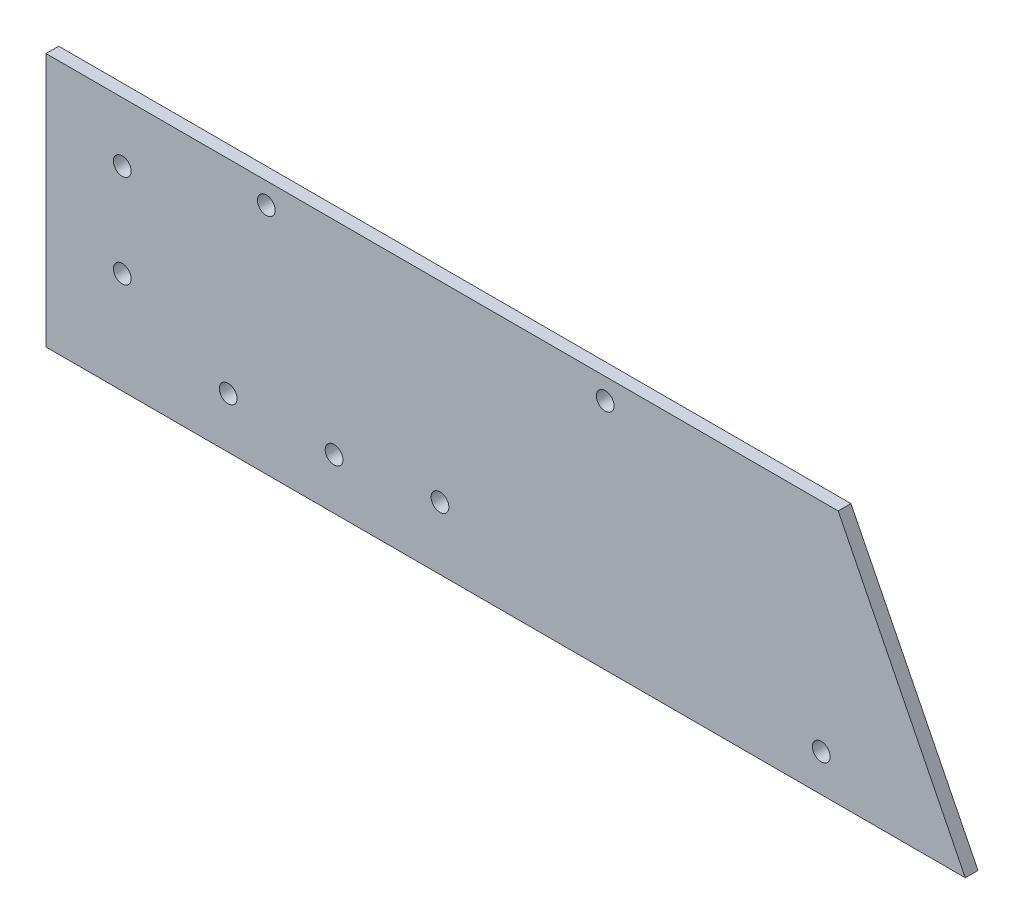
ISO-10303-21;
HEADER;
FILE_DESCRIPTION(('STEP AP214'),'2;1');
FILE_NAME('part.step','',(''),(''),'','','');
FILE_SCHEMA(('AUTOMOTIVE_DESIGN { 1 0 10303 214 1 1 1 1 }'));
ENDSEC;
DATA;
#1=APPLICATION_CONTEXT('core data for automotive mechanical design processes');
#2=APPLICATION_PROTOCOL_DEFINITION('international standard','automotive_design',2000,#1);
#3=PRODUCT_CONTEXT('',#1,'mechanical');
#4=PRODUCT('Part','Part','',(#3));
#5=PRODUCT_RELATED_PRODUCT_CATEGORY('part','',(#4));
#6=PRODUCT_DEFINITION_FORMATION('','',#4);
#7=PRODUCT_DEFINITION_CONTEXT('part definition',#1,'design');
#8=PRODUCT_DEFINITION('design','',#6,#7);
#9=PRODUCT_DEFINITION_SHAPE('','',#8);
#10=(LENGTH_UNIT() NAMED_UNIT(*) SI_UNIT(.MILLI.,.METRE.));
#11=(NAMED_UNIT(*) PLANE_ANGLE_UNIT() SI_UNIT($,.RADIAN.));
#12=(NAMED_UNIT(*) SI_UNIT($,.STERADIAN.) SOLID_ANGLE_UNIT());
#13=UNCERTAINTY_MEASURE_WITH_UNIT(LENGTH_MEASURE(1.E-05),#10,'distance_accuracy_value','');
#14=(GEOMETRIC_REPRESENTATION_CONTEXT(3) GLOBAL_UNCERTAINTY_ASSIGNED_CONTEXT((#13)) GLOBAL_UNIT_ASSIGNED_CONTEXT((#10,
#11,#12)) REPRESENTATION_CONTEXT('',''));
#15=CARTESIAN_POINT('',(0.,0.,0.));
#16=DIRECTION('',(0.,0.,1.));
#17=DIRECTION('',(1.,0.,0.));
#18=AXIS2_PLACEMENT_3D('',#15,#16,#17);
#19=CARTESIAN_POINT('',(0.,60.,3.));
#20=DIRECTION('',(0.,-1.,0.));
#21=DIRECTION('',(0.,0.,-1.));
#22=AXIS2_PLACEMENT_3D('',#19,#20,#21);
#23=PLANE('',#22);
#24=DIRECTION('',(0.,0.,1.));
#25=VECTOR('',#24,1.);
#26=CARTESIAN_POINT('',(187.,60.,0.));
#27=LINE('',#26,#25);
#28=CARTESIAN_POINT('',(187.,60.,0.));
#29=VERTEX_POINT('',#28);
#30=CARTESIAN_POINT('',(187.,60.,3.));
#31=VERTEX_POINT('',#30);
#32=EDGE_CURVE('E88',#29,#31,#27,.T.);
#33=ORIENTED_EDGE('',*,*,#32,.F.);
#34=DIRECTION('',(-1.,0.,0.));
#35=VECTOR('',#34,1.);
#36=CARTESIAN_POINT('',(0.,60.,0.));
#37=LINE('',#36,#35);
#38=CARTESIAN_POINT('',(0.,60.,0.));
#39=VERTEX_POINT('',#38);
#40=EDGE_CURVE('E83',#29,#39,#37,.T.);
#41=ORIENTED_EDGE('',*,*,#40,.T.);
#42=DIRECTION('',(0.,0.,-1.));
#43=VECTOR('',#42,1.);
#44=CARTESIAN_POINT('',(0.,60.,3.));
#45=LINE('',#44,#43);
#46=CARTESIAN_POINT('',(0.,60.,3.));
#47=VERTEX_POINT('',#46);
#48=EDGE_CURVE('E85',#47,#39,#45,.T.);
#49=ORIENTED_EDGE('',*,*,#48,.F.);
#50=DIRECTION('',(-1.,0.,0.));
#51=VECTOR('',#50,1.);
#52=CARTESIAN_POINT('',(0.,60.,3.));
#53=LINE('',#52,#51);
#54=EDGE_CURVE('E63',#31,#47,#53,.T.);
#55=ORIENTED_EDGE('',*,*,#54,.F.);
#56=EDGE_LOOP('',(#33,#41,#49,#55));
#57=FACE_BOUND('',#56,.T.);
#58=ADVANCED_FACE('F45',(#57),#23,.F.);
#59=CARTESIAN_POINT('',(0.,0.,3.));
#60=DIRECTION('',(0.,0.,-1.));
#61=DIRECTION('',(-1.,0.,0.));
#62=AXIS2_PLACEMENT_3D('',#59,#60,#61);
#63=PLANE('',#62);
#64=CARTESIAN_POINT('',(132.,55.0000000000013,3.));
#65=DIRECTION('',(0.,0.,-1.));
#66=DIRECTION('',(-1.,0.,0.));
#67=AXIS2_PLACEMENT_3D('',#64,#65,#66);
#68=CIRCLE('',#67,2.09999999999999);
#69=CARTESIAN_POINT('',(129.9,55.0000000000013,3.));
#70=VERTEX_POINT('',#69);
#71=EDGE_CURVE('E170',#70,#70,#68,.T.);
#72=ORIENTED_EDGE('',*,*,#71,.T.);
#73=EDGE_LOOP('',(#72));
#74=FACE_BOUND('',#73,.T.);
#75=CARTESIAN_POINT('',(51.9999999999998,55.0000000000008,3.));
#76=DIRECTION('',(0.,0.,-1.));
#77=DIRECTION('',(-1.,0.,0.));
#78=AXIS2_PLACEMENT_3D('',#75,#76,#77);
#79=CIRCLE('',#78,2.09999999999999);
#80=CARTESIAN_POINT('',(49.8999999999998,55.0000000000008,3.));
#81=VERTEX_POINT('',#80);
#82=EDGE_CURVE('E174',#81,#81,#79,.T.);
#83=ORIENTED_EDGE('',*,*,#82,.T.);
#84=EDGE_LOOP('',(#83));
#85=FACE_BOUND('',#84,.T.);
#86=CARTESIAN_POINT('',(18.0000000000016,45.9999999999995,3.));
#87=DIRECTION('',(0.,0.,1.));
#88=DIRECTION('',(1.,0.,0.));
#89=AXIS2_PLACEMENT_3D('',#86,#87,#88);
#90=CIRCLE('',#89,2.1);
#91=CARTESIAN_POINT('',(20.1000000000016,45.9999999999995,3.));
#92=VERTEX_POINT('',#91);
#93=EDGE_CURVE('E166',#92,#92,#90,.T.);
#94=ORIENTED_EDGE('',*,*,#93,.F.);
#95=EDGE_LOOP('',(#94));
#96=FACE_BOUND('',#95,.T.);
#97=CARTESIAN_POINT('',(92.9999999999996,14.7999999999999,3.));
#98=DIRECTION('',(0.,0.,1.));
#99=DIRECTION('',(1.,0.,0.));
#100=AXIS2_PLACEMENT_3D('',#97,#98,#99);
#101=CIRCLE('',#100,2.09999999999999);
#102=CARTESIAN_POINT('',(95.0999999999996,14.7999999999999,3.));
#103=VERTEX_POINT('',#102);
#104=EDGE_CURVE('E159',#103,#103,#101,.T.);
#105=ORIENTED_EDGE('',*,*,#104,.F.);
#106=EDGE_LOOP('',(#105));
#107=FACE_BOUND('',#106,.T.);
#108=CARTESIAN_POINT('',(183.,8.79999999999957,3.));
#109=DIRECTION('',(0.,0.,1.));
#110=DIRECTION('',(1.,0.,0.));
#111=AXIS2_PLACEMENT_3D('',#108,#109,#110);
#112=CIRCLE('',#111,2.10000000000002);
#113=CARTESIAN_POINT('',(185.1,8.79999999999957,3.));
#114=VERTEX_POINT('',#113);
#115=EDGE_CURVE('E150',#114,#114,#112,.T.);
#116=ORIENTED_EDGE('',*,*,#115,.F.);
#117=EDGE_LOOP('',(#116));
#118=FACE_BOUND('',#117,.T.);
#119=CARTESIAN_POINT('',(18.0000000000016,23.9999999999994,3.));
#120=DIRECTION('',(0.,0.,-1.));
#121=DIRECTION('',(-1.,0.,0.));
#122=AXIS2_PLACEMENT_3D('',#119,#120,#121);
#123=CIRCLE('',#122,2.1);
#124=CARTESIAN_POINT('',(15.9000000000016,23.9999999999994,3.));
#125=VERTEX_POINT('',#124);
#126=EDGE_CURVE('E123',#125,#125,#123,.T.);
#127=ORIENTED_EDGE('',*,*,#126,.T.);
#128=EDGE_LOOP('',(#127));
#129=FACE_BOUND('',#128,.T.);
#130=CARTESIAN_POINT('',(43.0000000000016,11.9999999999994,3.));
#131=DIRECTION('',(0.,0.,-1.));
#132=DIRECTION('',(-1.,0.,0.));
#133=AXIS2_PLACEMENT_3D('',#130,#131,#132);
#134=CIRCLE('',#133,2.1);
#135=CARTESIAN_POINT('',(40.9000000000016,11.9999999999994,3.));
#136=VERTEX_POINT('',#135);
#137=EDGE_CURVE('E139',#136,#136,#134,.T.);
#138=ORIENTED_EDGE('',*,*,#137,.T.);
#139=EDGE_LOOP('',(#138));
#140=FACE_BOUND('',#139,.T.);
#141=CARTESIAN_POINT('',(68.0000000000016,11.9999999999994,3.));
#142=DIRECTION('',(0.,0.,-1.));
#143=DIRECTION('',(-1.,0.,0.));
#144=AXIS2_PLACEMENT_3D('',#141,#142,#143);
#145=CIRCLE('',#144,2.1);
#146=CARTESIAN_POINT('',(65.9000000000016,11.9999999999994,3.));
#147=VERTEX_POINT('',#146);
#148=EDGE_CURVE('E130',#147,#147,#145,.T.);
#149=ORIENTED_EDGE('',*,*,#148,.T.);
#150=EDGE_LOOP('',(#149));
#151=FACE_BOUND('',#150,.T.);
#152=DIRECTION('',(-0.447213595499958,0.894427190999916,0.));
#153=VECTOR('',#152,1.);
#154=CARTESIAN_POINT('',(173.6,86.8,3.));
#155=LINE('',#154,#153);
#156=CARTESIAN_POINT('',(217.,0.,3.));
#157=VERTEX_POINT('',#156);
#158=EDGE_CURVE('E120',#157,#31,#155,.T.);
#159=ORIENTED_EDGE('',*,*,#158,.T.);
#160=ORIENTED_EDGE('',*,*,#54,.T.);
#161=DIRECTION('',(0.,-1.,0.));
#162=VECTOR('',#161,1.);
#163=CARTESIAN_POINT('',(0.,0.,3.));
#164=LINE('',#163,#162);
#165=CARTESIAN_POINT('',(0.,0.,3.));
#166=VERTEX_POINT('',#165);
#167=EDGE_CURVE('E92',#47,#166,#164,.T.);
#168=ORIENTED_EDGE('',*,*,#167,.T.);
#169=DIRECTION('',(1.,0.,0.));
#170=VECTOR('',#169,1.);
#171=CARTESIAN_POINT('',(0.,0.,3.));
#172=LINE('',#171,#170);
#173=EDGE_CURVE('E115',#166,#157,#172,.T.);
#174=ORIENTED_EDGE('',*,*,#173,.T.);
#175=EDGE_LOOP('',(#159,#160,#168,#174));
#176=FACE_BOUND('',#175,.T.);
#177=ADVANCED_FACE('F190',(#74,#85,#96,#107,#118,#129,#140,#151,#176),#63,.F.);
#178=CARTESIAN_POINT('',(0.,0.,0.));
#179=DIRECTION('',(0.,0.,-1.));
#180=DIRECTION('',(-1.,0.,0.));
#181=AXIS2_PLACEMENT_3D('',#178,#179,#180);
#182=PLANE('',#181);
#183=CARTESIAN_POINT('',(132.,55.0000000000013,0.));
#184=DIRECTION('',(0.,0.,-1.));
#185=DIRECTION('',(-1.,0.,0.));
#186=AXIS2_PLACEMENT_3D('',#183,#184,#185);
#187=CIRCLE('',#186,2.09999999999999);
#188=CARTESIAN_POINT('',(129.9,55.0000000000013,0.));
#189=VERTEX_POINT('',#188);
#190=EDGE_CURVE('E182',#189,#189,#187,.T.);
#191=ORIENTED_EDGE('',*,*,#190,.F.);
#192=EDGE_LOOP('',(#191));
#193=FACE_BOUND('',#192,.T.);
#194=CARTESIAN_POINT('',(51.9999999999998,55.0000000000008,0.));
#195=DIRECTION('',(0.,0.,-1.));
#196=DIRECTION('',(-1.,0.,0.));
#197=AXIS2_PLACEMENT_3D('',#194,#195,#196);
#198=CIRCLE('',#197,2.09999999999999);
#199=CARTESIAN_POINT('',(49.8999999999998,55.0000000000008,0.));
#200=VERTEX_POINT('',#199);
#201=EDGE_CURVE('E178',#200,#200,#198,.T.);
#202=ORIENTED_EDGE('',*,*,#201,.F.);
#203=EDGE_LOOP('',(#202));
#204=FACE_BOUND('',#203,.T.);
#205=CARTESIAN_POINT('',(18.0000000000016,45.9999999999995,0.));
#206=DIRECTION('',(0.,0.,1.));
#207=DIRECTION('',(1.,0.,0.));
#208=AXIS2_PLACEMENT_3D('',#205,#206,#207);
#209=CIRCLE('',#208,2.1);
#210=CARTESIAN_POINT('',(20.1000000000016,45.9999999999995,0.));
#211=VERTEX_POINT('',#210);
#212=EDGE_CURVE('E155',#211,#211,#209,.T.);
#213=ORIENTED_EDGE('',*,*,#212,.T.);
#214=EDGE_LOOP('',(#213));
#215=FACE_BOUND('',#214,.T.);
#216=CARTESIAN_POINT('',(92.9999999999996,14.7999999999999,0.));
#217=DIRECTION('',(0.,0.,1.));
#218=DIRECTION('',(1.,0.,0.));
#219=AXIS2_PLACEMENT_3D('',#216,#217,#218);
#220=CIRCLE('',#219,2.09999999999999);
#221=CARTESIAN_POINT('',(95.0999999999996,14.7999999999999,0.));
#222=VERTEX_POINT('',#221);
#223=EDGE_CURVE('E131',#222,#222,#220,.T.);
#224=ORIENTED_EDGE('',*,*,#223,.T.);
#225=EDGE_LOOP('',(#224));
#226=FACE_BOUND('',#225,.T.);
#227=CARTESIAN_POINT('',(183.,8.79999999999957,0.));
#228=DIRECTION('',(0.,0.,1.));
#229=DIRECTION('',(1.,0.,0.));
#230=AXIS2_PLACEMENT_3D('',#227,#228,#229);
#231=CIRCLE('',#230,2.10000000000002);
#232=CARTESIAN_POINT('',(185.1,8.79999999999957,0.));
#233=VERTEX_POINT('',#232);
#234=EDGE_CURVE('E154',#233,#233,#231,.T.);
#235=ORIENTED_EDGE('',*,*,#234,.T.);
#236=EDGE_LOOP('',(#235));
#237=FACE_BOUND('',#236,.T.);
#238=CARTESIAN_POINT('',(18.0000000000016,23.9999999999994,0.));
#239=DIRECTION('',(0.,0.,-1.));
#240=DIRECTION('',(-1.,0.,0.));
#241=AXIS2_PLACEMENT_3D('',#238,#239,#240);
#242=CIRCLE('',#241,2.1);
#243=CARTESIAN_POINT('',(15.9000000000016,23.9999999999994,0.));
#244=VERTEX_POINT('',#243);
#245=EDGE_CURVE('E143',#244,#244,#242,.T.);
#246=ORIENTED_EDGE('',*,*,#245,.F.);
#247=EDGE_LOOP('',(#246));
#248=FACE_BOUND('',#247,.T.);
#249=CARTESIAN_POINT('',(43.0000000000016,11.9999999999994,0.));
#250=DIRECTION('',(0.,0.,-1.));
#251=DIRECTION('',(-1.,0.,0.));
#252=AXIS2_PLACEMENT_3D('',#249,#250,#251);
#253=CIRCLE('',#252,2.1);
#254=CARTESIAN_POINT('',(40.9000000000016,11.9999999999994,0.));
#255=VERTEX_POINT('',#254);
#256=EDGE_CURVE('E135',#255,#255,#253,.T.);
#257=ORIENTED_EDGE('',*,*,#256,.F.);
#258=EDGE_LOOP('',(#257));
#259=FACE_BOUND('',#258,.T.);
#260=CARTESIAN_POINT('',(68.0000000000016,11.9999999999994,0.));
#261=DIRECTION('',(0.,0.,-1.));
#262=DIRECTION('',(-1.,0.,0.));
#263=AXIS2_PLACEMENT_3D('',#260,#261,#262);
#264=CIRCLE('',#263,2.1);
#265=CARTESIAN_POINT('',(65.9000000000016,11.9999999999994,0.));
#266=VERTEX_POINT('',#265);
#267=EDGE_CURVE('E126',#266,#266,#264,.T.);
#268=ORIENTED_EDGE('',*,*,#267,.F.);
#269=EDGE_LOOP('',(#268));
#270=FACE_BOUND('',#269,.T.);
#271=ORIENTED_EDGE('',*,*,#40,.F.);
#272=DIRECTION('',(-0.447213595499958,0.894427190999916,0.));
#273=VECTOR('',#272,1.);
#274=CARTESIAN_POINT('',(173.6,86.8,0.));
#275=LINE('',#274,#273);
#276=CARTESIAN_POINT('',(217.,0.,0.));
#277=VERTEX_POINT('',#276);
#278=EDGE_CURVE('E108',#277,#29,#275,.T.);
#279=ORIENTED_EDGE('',*,*,#278,.F.);
#280=DIRECTION('',(1.,0.,0.));
#281=VECTOR('',#280,1.);
#282=CARTESIAN_POINT('',(0.,0.,0.));
#283=LINE('',#282,#281);
#284=CARTESIAN_POINT('',(0.,0.,0.));
#285=VERTEX_POINT('',#284);
#286=EDGE_CURVE('E93',#285,#277,#283,.T.);
#287=ORIENTED_EDGE('',*,*,#286,.F.);
#288=DIRECTION('',(0.,-1.,0.));
#289=VECTOR('',#288,1.);
#290=CARTESIAN_POINT('',(0.,0.,0.));
#291=LINE('',#290,#289);
#292=EDGE_CURVE('E98',#39,#285,#291,.T.);
#293=ORIENTED_EDGE('',*,*,#292,.F.);
#294=EDGE_LOOP('',(#271,#279,#287,#293));
#295=FACE_BOUND('',#294,.T.);
#296=ADVANCED_FACE('F101',(#193,#204,#215,#226,#237,#248,#259,#270,#295),#182,.T.);
#297=CARTESIAN_POINT('',(0.,0.,3.));
#298=DIRECTION('',(1.,0.,0.));
#299=DIRECTION('',(0.,0.,-1.));
#300=AXIS2_PLACEMENT_3D('',#297,#298,#299);
#301=PLANE('',#300);
#302=ORIENTED_EDGE('',*,*,#292,.T.);
#303=DIRECTION('',(0.,0.,-1.));
#304=VECTOR('',#303,1.);
#305=CARTESIAN_POINT('',(0.,0.,3.));
#306=LINE('',#305,#304);
#307=EDGE_CURVE('E12',#166,#285,#306,.T.);
#308=ORIENTED_EDGE('',*,*,#307,.F.);
#309=ORIENTED_EDGE('',*,*,#167,.F.);
#310=ORIENTED_EDGE('',*,*,#48,.T.);
#311=EDGE_LOOP('',(#302,#308,#309,#310));
#312=FACE_BOUND('',#311,.T.);
#313=ADVANCED_FACE('F47',(#312),#301,.F.);
#314=CARTESIAN_POINT('',(0.,0.,3.));
#315=DIRECTION('',(0.,1.,0.));
#316=DIRECTION('',(0.,0.,1.));
#317=AXIS2_PLACEMENT_3D('',#314,#315,#316);
#318=PLANE('',#317);
#319=ORIENTED_EDGE('',*,*,#286,.T.);
#320=DIRECTION('',(0.,0.,-1.));
#321=VECTOR('',#320,1.);
#322=CARTESIAN_POINT('',(217.,0.,3.));
#323=LINE('',#322,#321);
#324=EDGE_CURVE('E55',#157,#277,#323,.T.);
#325=ORIENTED_EDGE('',*,*,#324,.F.);
#326=ORIENTED_EDGE('',*,*,#173,.F.);
#327=ORIENTED_EDGE('',*,*,#307,.T.);
#328=EDGE_LOOP('',(#319,#325,#326,#327));
#329=FACE_BOUND('',#328,.T.);
#330=ADVANCED_FACE('F230',(#329),#318,.F.);
#331=CARTESIAN_POINT('',(173.6,86.8,0.));
#332=DIRECTION('',(0.894427190999916,0.447213595499958,0.));
#333=DIRECTION('',(-0.447213595499958,0.894427190999916,0.));
#334=AXIS2_PLACEMENT_3D('',#331,#332,#333);
#335=PLANE('',#334);
#336=ORIENTED_EDGE('',*,*,#158,.F.);
#337=ORIENTED_EDGE('',*,*,#324,.T.);
#338=ORIENTED_EDGE('',*,*,#278,.T.);
#339=ORIENTED_EDGE('',*,*,#32,.T.);
#340=EDGE_LOOP('',(#336,#337,#338,#339));
#341=FACE_BOUND('',#340,.T.);
#342=ADVANCED_FACE('F220',(#341),#335,.T.);
#343=CARTESIAN_POINT('',(68.0000000000016,11.9999999999994,3.));
#344=DIRECTION('',(0.,0.,-1.));
#345=DIRECTION('',(-1.,0.,0.));
#346=AXIS2_PLACEMENT_3D('',#343,#344,#345);
#347=CYLINDRICAL_SURFACE('',#346,2.1);
#348=ORIENTED_EDGE('',*,*,#148,.F.);
#349=EDGE_LOOP('',(#348));
#350=FACE_BOUND('',#349,.T.);
#351=ORIENTED_EDGE('',*,*,#267,.T.);
#352=EDGE_LOOP('',(#351));
#353=FACE_BOUND('',#352,.T.);
#354=ADVANCED_FACE('F217',(#350,#353),#347,.F.);
#355=CARTESIAN_POINT('',(43.0000000000016,11.9999999999994,3.));
#356=DIRECTION('',(0.,0.,-1.));
#357=DIRECTION('',(-1.,0.,0.));
#358=AXIS2_PLACEMENT_3D('',#355,#356,#357);
#359=CYLINDRICAL_SURFACE('',#358,2.1);
#360=ORIENTED_EDGE('',*,*,#137,.F.);
#361=EDGE_LOOP('',(#360));
#362=FACE_BOUND('',#361,.T.);
#363=ORIENTED_EDGE('',*,*,#256,.T.);
#364=EDGE_LOOP('',(#363));
#365=FACE_BOUND('',#364,.T.);
#366=ADVANCED_FACE('F219',(#362,#365),#359,.F.);
#367=CARTESIAN_POINT('',(18.0000000000016,23.9999999999994,3.));
#368=DIRECTION('',(0.,0.,-1.));
#369=DIRECTION('',(-1.,0.,0.));
#370=AXIS2_PLACEMENT_3D('',#367,#368,#369);
#371=CYLINDRICAL_SURFACE('',#370,2.1);
#372=ORIENTED_EDGE('',*,*,#126,.F.);
#373=EDGE_LOOP('',(#372));
#374=FACE_BOUND('',#373,.T.);
#375=ORIENTED_EDGE('',*,*,#245,.T.);
#376=EDGE_LOOP('',(#375));
#377=FACE_BOUND('',#376,.T.);
#378=ADVANCED_FACE('F227',(#374,#377),#371,.F.);
#379=CARTESIAN_POINT('',(183.,8.79999999999957,0.));
#380=DIRECTION('',(0.,0.,1.));
#381=DIRECTION('',(1.,0.,0.));
#382=AXIS2_PLACEMENT_3D('',#379,#380,#381);
#383=CYLINDRICAL_SURFACE('',#382,2.10000000000002);
#384=ORIENTED_EDGE('',*,*,#234,.F.);
#385=EDGE_LOOP('',(#384));
#386=FACE_BOUND('',#385,.T.);
#387=ORIENTED_EDGE('',*,*,#115,.T.);
#388=EDGE_LOOP('',(#387));
#389=FACE_BOUND('',#388,.T.);
#390=ADVANCED_FACE('F294',(#386,#389),#383,.F.);
#391=CARTESIAN_POINT('',(92.9999999999996,14.7999999999999,0.));
#392=DIRECTION('',(0.,0.,1.));
#393=DIRECTION('',(1.,0.,0.));
#394=AXIS2_PLACEMENT_3D('',#391,#392,#393);
#395=CYLINDRICAL_SURFACE('',#394,2.09999999999999);
#396=ORIENTED_EDGE('',*,*,#223,.F.);
#397=EDGE_LOOP('',(#396));
#398=FACE_BOUND('',#397,.T.);
#399=ORIENTED_EDGE('',*,*,#104,.T.);
#400=EDGE_LOOP('',(#399));
#401=FACE_BOUND('',#400,.T.);
#402=ADVANCED_FACE('F304',(#398,#401),#395,.F.);
#403=CARTESIAN_POINT('',(18.0000000000016,45.9999999999995,0.));
#404=DIRECTION('',(0.,0.,1.));
#405=DIRECTION('',(1.,0.,0.));
#406=AXIS2_PLACEMENT_3D('',#403,#404,#405);
#407=CYLINDRICAL_SURFACE('',#406,2.1);
#408=ORIENTED_EDGE('',*,*,#212,.F.);
#409=EDGE_LOOP('',(#408));
#410=FACE_BOUND('',#409,.T.);
#411=ORIENTED_EDGE('',*,*,#93,.T.);
#412=EDGE_LOOP('',(#411));
#413=FACE_BOUND('',#412,.T.);
#414=ADVANCED_FACE('F314',(#410,#413),#407,.F.);
#415=CARTESIAN_POINT('',(51.9999999999998,55.0000000000008,3.));
#416=DIRECTION('',(0.,0.,-1.));
#417=DIRECTION('',(-1.,0.,0.));
#418=AXIS2_PLACEMENT_3D('',#415,#416,#417);
#419=CYLINDRICAL_SURFACE('',#418,2.09999999999999);
#420=ORIENTED_EDGE('',*,*,#82,.F.);
#421=EDGE_LOOP('',(#420));
#422=FACE_BOUND('',#421,.T.);
#423=ORIENTED_EDGE('',*,*,#201,.T.);
#424=EDGE_LOOP('',(#423));
#425=FACE_BOUND('',#424,.T.);
#426=ADVANCED_FACE('F196',(#422,#425),#419,.F.);
#427=CARTESIAN_POINT('',(132.,55.0000000000013,3.));
#428=DIRECTION('',(0.,0.,-1.));
#429=DIRECTION('',(-1.,0.,0.));
#430=AXIS2_PLACEMENT_3D('',#427,#428,#429);
#431=CYLINDRICAL_SURFACE('',#430,2.09999999999999);
#432=ORIENTED_EDGE('',*,*,#71,.F.);
#433=EDGE_LOOP('',(#432));
#434=FACE_BOUND('',#433,.T.);
#435=ORIENTED_EDGE('',*,*,#190,.T.);
#436=EDGE_LOOP('',(#435));
#437=FACE_BOUND('',#436,.T.);
#438=ADVANCED_FACE('F193',(#434,#437),#431,.F.);
#439=CLOSED_SHELL('',(#58,#177,#296,#313,#330,#342,#354,#366,#378,#390,#402,#414,#426,#438));
#440=MANIFOLD_SOLID_BREP('B2',#439);
#441=ADVANCED_BREP_SHAPE_REPRESENTATION('',(#18,#440),#14);
#442=SHAPE_DEFINITION_REPRESENTATION(#9,#441);
ENDSEC;
END-ISO-10303-21;
